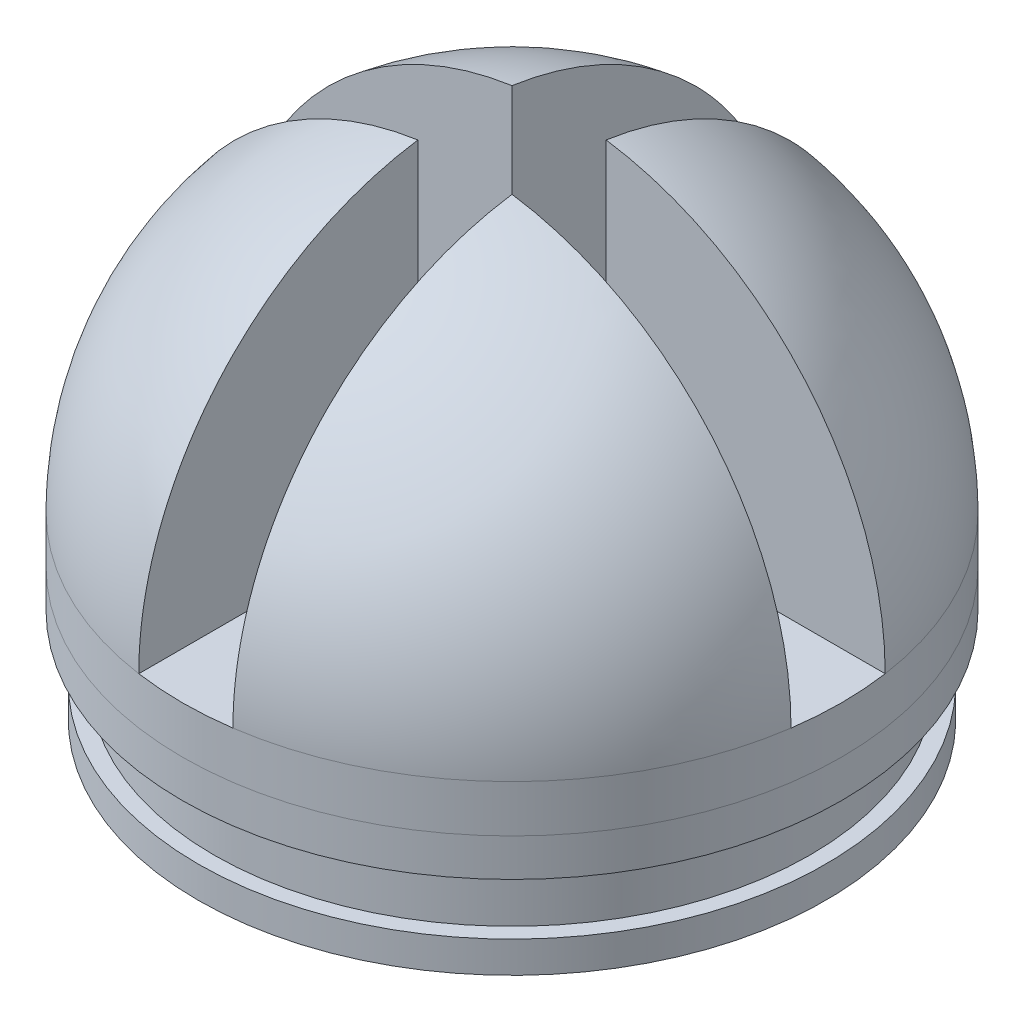
ISO-10303-21;
HEADER;
FILE_DESCRIPTION(('STEP AP214'),'2;1');
FILE_NAME('part.step','',(''),(''),'','','');
FILE_SCHEMA(('AUTOMOTIVE_DESIGN { 1 0 10303 214 1 1 1 1 }'));
ENDSEC;
DATA;
#1=APPLICATION_CONTEXT('core data for automotive mechanical design processes');
#2=APPLICATION_PROTOCOL_DEFINITION('international standard','automotive_design',2000,#1);
#3=PRODUCT_CONTEXT('',#1,'mechanical');
#4=PRODUCT('Part','Part','',(#3));
#5=PRODUCT_RELATED_PRODUCT_CATEGORY('part','',(#4));
#6=PRODUCT_DEFINITION_FORMATION('','',#4);
#7=PRODUCT_DEFINITION_CONTEXT('part definition',#1,'design');
#8=PRODUCT_DEFINITION('design','',#6,#7);
#9=PRODUCT_DEFINITION_SHAPE('','',#8);
#10=(LENGTH_UNIT() NAMED_UNIT(*) SI_UNIT(.MILLI.,.METRE.));
#11=(NAMED_UNIT(*) PLANE_ANGLE_UNIT() SI_UNIT($,.RADIAN.));
#12=(NAMED_UNIT(*) SI_UNIT($,.STERADIAN.) SOLID_ANGLE_UNIT());
#13=UNCERTAINTY_MEASURE_WITH_UNIT(LENGTH_MEASURE(1.E-05),#10,'distance_accuracy_value','');
#14=(GEOMETRIC_REPRESENTATION_CONTEXT(3) GLOBAL_UNCERTAINTY_ASSIGNED_CONTEXT((#13)) GLOBAL_UNIT_ASSIGNED_CONTEXT((#10,
#11,#12)) REPRESENTATION_CONTEXT('',''));
#15=CARTESIAN_POINT('',(0.,0.,0.));
#16=DIRECTION('',(0.,0.,1.));
#17=DIRECTION('',(1.,0.,0.));
#18=AXIS2_PLACEMENT_3D('',#15,#16,#17);
#19=CARTESIAN_POINT('',(0.00115388982795082,2.84938011278044,0.));
#20=DIRECTION('',(0.,1.,0.));
#21=DIRECTION('',(0.,0.,1.));
#22=AXIS2_PLACEMENT_3D('',#19,#20,#21);
#23=PLANE('',#22);
#24=DIRECTION('',(0.,0.,-1.));
#25=VECTOR('',#24,1.);
#26=CARTESIAN_POINT('',(38.101153889828,2.84938011278044,38.1));
#27=LINE('',#26,#25);
#28=CARTESIAN_POINT('',(38.101153889828,2.84938011278044,263.964543073497));
#29=VERTEX_POINT('',#28);
#30=CARTESIAN_POINT('',(38.101153889828,2.84938011278044,-263.964543073497));
#31=VERTEX_POINT('',#30);
#32=EDGE_CURVE('E300',#29,#31,#27,.T.);
#33=ORIENTED_EDGE('',*,*,#32,.T.);
#34=CARTESIAN_POINT('',(0.00115388982795082,2.84938011278042,0.));
#35=DIRECTION('',(0.,1.,0.));
#36=DIRECTION('',(0.,0.,1.));
#37=AXIS2_PLACEMENT_3D('',#34,#35,#36);
#38=CIRCLE('',#37,266.7);
#39=CARTESIAN_POINT('',(-38.098846110172,2.84938011278044,-263.964543073497));
#40=VERTEX_POINT('',#39);
#41=EDGE_CURVE('E276',#31,#40,#38,.T.);
#42=ORIENTED_EDGE('',*,*,#41,.T.);
#43=DIRECTION('',(0.,0.,1.));
#44=VECTOR('',#43,1.);
#45=CARTESIAN_POINT('',(-38.098846110172,2.84938011278044,38.1));
#46=LINE('',#45,#44);
#47=CARTESIAN_POINT('',(-38.098846110172,2.84938011278042,263.964543073497));
#48=VERTEX_POINT('',#47);
#49=EDGE_CURVE('E221',#40,#48,#46,.T.);
#50=ORIENTED_EDGE('',*,*,#49,.T.);
#51=EDGE_CURVE('E232',#48,#29,#38,.T.);
#52=ORIENTED_EDGE('',*,*,#51,.T.);
#53=EDGE_LOOP('',(#33,#42,#50,#52));
#54=FACE_BOUND('',#53,.T.);
#55=ADVANCED_FACE('F38',(#54),#23,.T.);
#56=DIRECTION('',(-1.,0.,0.));
#57=VECTOR('',#56,1.);
#58=CARTESIAN_POINT('',(263.965696963325,2.84938011278044,-38.1));
#59=LINE('',#58,#57);
#60=CARTESIAN_POINT('',(263.965696963325,2.84938011278044,-38.1));
#61=VERTEX_POINT('',#60);
#62=CARTESIAN_POINT('',(76.3350100540597,2.84938011278044,-38.0999999999999));
#63=VERTEX_POINT('',#62);
#64=EDGE_CURVE('E226',#61,#63,#59,.T.);
#65=ORIENTED_EDGE('',*,*,#64,.T.);
#66=DIRECTION('',(0.,0.,-1.));
#67=VECTOR('',#66,1.);
#68=CARTESIAN_POINT('',(76.3350100540596,2.84938011278044,38.1));
#69=LINE('',#68,#67);
#70=CARTESIAN_POINT('',(76.3350100540596,2.84938011278044,38.1));
#71=VERTEX_POINT('',#70);
#72=EDGE_CURVE('E304',#71,#63,#69,.T.);
#73=ORIENTED_EDGE('',*,*,#72,.F.);
#74=DIRECTION('',(1.,0.,0.));
#75=VECTOR('',#74,1.);
#76=CARTESIAN_POINT('',(38.101153889828,2.84938011278044,38.1));
#77=LINE('',#76,#75);
#78=CARTESIAN_POINT('',(263.965696963325,2.84938011278044,38.1));
#79=VERTEX_POINT('',#78);
#80=EDGE_CURVE('E292',#71,#79,#77,.T.);
#81=ORIENTED_EDGE('',*,*,#80,.T.);
#82=EDGE_CURVE('E240',#79,#61,#38,.T.);
#83=ORIENTED_EDGE('',*,*,#82,.T.);
#84=EDGE_LOOP('',(#65,#73,#81,#83));
#85=FACE_BOUND('',#84,.T.);
#86=ADVANCED_FACE('F185',(#85),#23,.T.);
#87=CARTESIAN_POINT('',(38.1011538898279,2.84938011278044,-38.0999999999999));
#88=DIRECTION('',(0.,0.,-1.));
#89=DIRECTION('',(-1.,0.,0.));
#90=AXIS2_PLACEMENT_3D('',#87,#88,#89);
#91=PLANE('',#90);
#92=DIRECTION('',(0.,-1.,0.));
#93=VECTOR('',#92,1.);
#94=CARTESIAN_POINT('',(76.3350100540597,117.14938011278,-38.0999999999999));
#95=LINE('',#94,#93);
#96=CARTESIAN_POINT('',(76.3350100540597,117.14938011278,-38.0999999999999));
#97=VERTEX_POINT('',#96);
#98=EDGE_CURVE('E298',#97,#63,#95,.T.);
#99=ORIENTED_EDGE('',*,*,#98,.T.);
#100=ORIENTED_EDGE('',*,*,#64,.F.);
#101=CARTESIAN_POINT('',(0.0011538898279394,2.84938011278042,-38.0999999999999));
#102=DIRECTION('',(0.,0.,-1.));
#103=DIRECTION('',(-1.,0.,0.));
#104=AXIS2_PLACEMENT_3D('',#101,#102,#103);
#105=CIRCLE('',#104,263.964543073497);
#106=CARTESIAN_POINT('',(38.1011538898279,264.04982038806,-38.0999999999999));
#107=VERTEX_POINT('',#106);
#108=EDGE_CURVE('E246',#61,#107,#105,.F.);
#109=ORIENTED_EDGE('',*,*,#108,.T.);
#110=DIRECTION('',(0.,1.,0.));
#111=VECTOR('',#110,1.);
#112=CARTESIAN_POINT('',(38.1011538898279,2.84938011278044,-38.0999999999999));
#113=LINE('',#112,#111);
#114=CARTESIAN_POINT('',(38.1011538898279,117.14938011278,-38.0999999999999));
#115=VERTEX_POINT('',#114);
#116=EDGE_CURVE('E235',#115,#107,#113,.T.);
#117=ORIENTED_EDGE('',*,*,#116,.F.);
#118=DIRECTION('',(-1.,0.,0.));
#119=VECTOR('',#118,1.);
#120=CARTESIAN_POINT('',(76.3350100540597,117.14938011278,-38.0999999999999));
#121=LINE('',#120,#119);
#122=EDGE_CURVE('E303',#97,#115,#121,.T.);
#123=ORIENTED_EDGE('',*,*,#122,.F.);
#124=EDGE_LOOP('',(#99,#100,#109,#117,#123));
#125=FACE_BOUND('',#124,.T.);
#126=ADVANCED_FACE('F192',(#125),#91,.F.);
#127=CARTESIAN_POINT('',(289.64463626496,2.84938011278044,38.1));
#128=DIRECTION('',(0.,0.,1.));
#129=DIRECTION('',(1.,0.,0.));
#130=AXIS2_PLACEMENT_3D('',#127,#128,#129);
#131=PLANE('',#130);
#132=DIRECTION('',(0.,-1.,0.));
#133=VECTOR('',#132,1.);
#134=CARTESIAN_POINT('',(76.3350100540596,117.14938011278,38.1));
#135=LINE('',#134,#133);
#136=CARTESIAN_POINT('',(76.3350100540596,117.14938011278,38.1));
#137=VERTEX_POINT('',#136);
#138=EDGE_CURVE('E317',#137,#71,#135,.T.);
#139=ORIENTED_EDGE('',*,*,#138,.F.);
#140=DIRECTION('',(1.,0.,0.));
#141=VECTOR('',#140,1.);
#142=CARTESIAN_POINT('',(38.101153889828,117.14938011278,38.1));
#143=LINE('',#142,#141);
#144=CARTESIAN_POINT('',(38.101153889828,117.14938011278,38.1));
#145=VERTEX_POINT('',#144);
#146=EDGE_CURVE('E306',#145,#137,#143,.T.);
#147=ORIENTED_EDGE('',*,*,#146,.F.);
#148=DIRECTION('',(0.,1.,0.));
#149=VECTOR('',#148,1.);
#150=CARTESIAN_POINT('',(38.101153889828,2.84938011278044,38.1));
#151=LINE('',#150,#149);
#152=CARTESIAN_POINT('',(38.101153889828,264.04982038806,38.1));
#153=VERTEX_POINT('',#152);
#154=EDGE_CURVE('E224',#145,#153,#151,.T.);
#155=ORIENTED_EDGE('',*,*,#154,.T.);
#156=CARTESIAN_POINT('',(0.00115388982795082,2.84938011278042,38.1));
#157=DIRECTION('',(0.,0.,1.));
#158=DIRECTION('',(1.,0.,0.));
#159=AXIS2_PLACEMENT_3D('',#156,#157,#158);
#160=CIRCLE('',#159,263.964543073497);
#161=EDGE_CURVE('E136',#153,#79,#160,.F.);
#162=ORIENTED_EDGE('',*,*,#161,.T.);
#163=ORIENTED_EDGE('',*,*,#80,.F.);
#164=EDGE_LOOP('',(#139,#147,#155,#162,#163));
#165=FACE_BOUND('',#164,.T.);
#166=ADVANCED_FACE('F426',(#165),#131,.F.);
#167=CARTESIAN_POINT('',(-274.646901319599,2.84938011278044,38.1));
#168=DIRECTION('',(0.,0.,1.));
#169=DIRECTION('',(1.,0.,0.));
#170=AXIS2_PLACEMENT_3D('',#167,#168,#169);
#171=PLANE('',#170);
#172=DIRECTION('',(0.,-1.,0.));
#173=VECTOR('',#172,1.);
#174=CARTESIAN_POINT('',(-76.5155730072906,117.14938011278,38.1));
#175=LINE('',#174,#173);
#176=CARTESIAN_POINT('',(-76.5155730072906,117.14938011278,38.1));
#177=VERTEX_POINT('',#176);
#178=CARTESIAN_POINT('',(-76.5155730072906,2.84938011278044,38.1));
#179=VERTEX_POINT('',#178);
#180=EDGE_CURVE('E328',#177,#179,#175,.T.);
#181=ORIENTED_EDGE('',*,*,#180,.T.);
#182=DIRECTION('',(1.,0.,0.));
#183=VECTOR('',#182,1.);
#184=CARTESIAN_POINT('',(-274.646901319599,2.84938011278044,38.1));
#185=LINE('',#184,#183);
#186=CARTESIAN_POINT('',(-263.963389183669,2.84938011278044,38.1));
#187=VERTEX_POINT('',#186);
#188=EDGE_CURVE('E212',#187,#179,#185,.T.);
#189=ORIENTED_EDGE('',*,*,#188,.F.);
#190=CARTESIAN_POINT('',(0.00115388982795082,2.84938011278042,38.1));
#191=DIRECTION('',(0.,0.,1.));
#192=DIRECTION('',(1.,0.,0.));
#193=AXIS2_PLACEMENT_3D('',#190,#191,#192);
#194=CIRCLE('',#193,263.964543073497);
#195=CARTESIAN_POINT('',(-38.098846110172,264.04982038806,38.1));
#196=VERTEX_POINT('',#195);
#197=EDGE_CURVE('E258',#187,#196,#194,.F.);
#198=ORIENTED_EDGE('',*,*,#197,.T.);
#199=DIRECTION('',(0.,1.,0.));
#200=VECTOR('',#199,1.);
#201=CARTESIAN_POINT('',(-38.098846110172,2.84938011278044,38.1));
#202=LINE('',#201,#200);
#203=CARTESIAN_POINT('',(-38.0988461101721,117.14938011278,38.1));
#204=VERTEX_POINT('',#203);
#205=EDGE_CURVE('E230',#204,#196,#202,.T.);
#206=ORIENTED_EDGE('',*,*,#205,.F.);
#207=DIRECTION('',(1.,0.,0.));
#208=VECTOR('',#207,1.);
#209=CARTESIAN_POINT('',(-38.0988461101721,117.14938011278,38.1));
#210=LINE('',#209,#208);
#211=EDGE_CURVE('E324',#177,#204,#210,.T.);
#212=ORIENTED_EDGE('',*,*,#211,.F.);
#213=EDGE_LOOP('',(#181,#189,#198,#206,#212));
#214=FACE_BOUND('',#213,.T.);
#215=ADVANCED_FACE('F206',(#214),#171,.F.);
#216=CARTESIAN_POINT('',(-274.646901319599,2.84938011278044,-38.1));
#217=DIRECTION('',(0.,0.,-1.));
#218=DIRECTION('',(-1.,0.,0.));
#219=AXIS2_PLACEMENT_3D('',#216,#217,#218);
#220=PLANE('',#219);
#221=DIRECTION('',(0.,-1.,0.));
#222=VECTOR('',#221,1.);
#223=CARTESIAN_POINT('',(-76.5155730072906,117.14938011278,-38.1));
#224=LINE('',#223,#222);
#225=CARTESIAN_POINT('',(-76.5155730072906,117.14938011278,-38.1));
#226=VERTEX_POINT('',#225);
#227=CARTESIAN_POINT('',(-76.5155730072906,2.84938011278044,-38.1));
#228=VERTEX_POINT('',#227);
#229=EDGE_CURVE('E331',#226,#228,#224,.T.);
#230=ORIENTED_EDGE('',*,*,#229,.F.);
#231=DIRECTION('',(-1.,0.,0.));
#232=VECTOR('',#231,1.);
#233=CARTESIAN_POINT('',(-76.5155730072906,117.14938011278,-38.1));
#234=LINE('',#233,#232);
#235=CARTESIAN_POINT('',(-38.098846110172,117.14938011278,-38.1));
#236=VERTEX_POINT('',#235);
#237=EDGE_CURVE('E319',#236,#226,#234,.T.);
#238=ORIENTED_EDGE('',*,*,#237,.F.);
#239=DIRECTION('',(0.,1.,0.));
#240=VECTOR('',#239,1.);
#241=CARTESIAN_POINT('',(-38.098846110172,2.84938011278044,-38.1));
#242=LINE('',#241,#240);
#243=CARTESIAN_POINT('',(-38.098846110172,264.04982038806,-38.1));
#244=VERTEX_POINT('',#243);
#245=EDGE_CURVE('E233',#236,#244,#242,.T.);
#246=ORIENTED_EDGE('',*,*,#245,.T.);
#247=CARTESIAN_POINT('',(0.00115388982795082,2.84938011278042,-38.1));
#248=DIRECTION('',(0.,0.,-1.));
#249=DIRECTION('',(-1.,0.,0.));
#250=AXIS2_PLACEMENT_3D('',#247,#248,#249);
#251=CIRCLE('',#250,263.964543073497);
#252=CARTESIAN_POINT('',(-263.963389183669,2.84938011278044,-38.1));
#253=VERTEX_POINT('',#252);
#254=EDGE_CURVE('E255',#244,#253,#251,.F.);
#255=ORIENTED_EDGE('',*,*,#254,.T.);
#256=DIRECTION('',(-1.,0.,0.));
#257=VECTOR('',#256,1.);
#258=CARTESIAN_POINT('',(-274.646901319599,2.84938011278044,-38.1));
#259=LINE('',#258,#257);
#260=EDGE_CURVE('E222',#228,#253,#259,.T.);
#261=ORIENTED_EDGE('',*,*,#260,.F.);
#262=EDGE_LOOP('',(#230,#238,#246,#255,#261));
#263=FACE_BOUND('',#262,.T.);
#264=ADVANCED_FACE('F198',(#263),#220,.F.);
#265=ORIENTED_EDGE('',*,*,#188,.T.);
#266=DIRECTION('',(0.,0.,1.));
#267=VECTOR('',#266,1.);
#268=CARTESIAN_POINT('',(-76.5155730072906,2.84938011278044,38.1));
#269=LINE('',#268,#267);
#270=EDGE_CURVE('E213',#228,#179,#269,.T.);
#271=ORIENTED_EDGE('',*,*,#270,.F.);
#272=ORIENTED_EDGE('',*,*,#260,.T.);
#273=EDGE_CURVE('E216',#253,#187,#38,.T.);
#274=ORIENTED_EDGE('',*,*,#273,.T.);
#275=EDGE_LOOP('',(#265,#271,#272,#274));
#276=FACE_BOUND('',#275,.T.);
#277=ADVANCED_FACE('F188',(#276),#23,.T.);
#278=CARTESIAN_POINT('',(0.00115388982795082,2.84938011278042,0.));
#279=DIRECTION('',(0.,0.,1.));
#280=DIRECTION('',(1.,0.,0.));
#281=AXIS2_PLACEMENT_3D('',#278,#279,#280);
#282=SPHERICAL_SURFACE('',#281,266.7);
#283=CARTESIAN_POINT('',(-38.098846110172,2.84938011278042,0.));
#284=DIRECTION('',(-1.,0.,0.));
#285=DIRECTION('',(0.,0.,1.));
#286=AXIS2_PLACEMENT_3D('',#283,#284,#285);
#287=CIRCLE('',#286,263.964543073497);
#288=EDGE_CURVE('E46',#196,#48,#287,.F.);
#289=ORIENTED_EDGE('',*,*,#288,.F.);
#290=ORIENTED_EDGE('',*,*,#197,.F.);
#291=EDGE_CURVE('E271',#187,#48,#38,.T.);
#292=ORIENTED_EDGE('',*,*,#291,.T.);
#293=EDGE_LOOP('',(#289,#290,#292));
#294=FACE_BOUND('',#293,.T.);
#295=ADVANCED_FACE('F197',(#294),#282,.T.);
#296=ORIENTED_EDGE('',*,*,#254,.F.);
#297=CARTESIAN_POINT('',(-38.098846110172,2.84938011278042,0.));
#298=DIRECTION('',(-1.,0.,0.));
#299=DIRECTION('',(0.,0.,1.));
#300=AXIS2_PLACEMENT_3D('',#297,#298,#299);
#301=CIRCLE('',#300,263.964543073497);
#302=EDGE_CURVE('E252',#40,#244,#301,.F.);
#303=ORIENTED_EDGE('',*,*,#302,.F.);
#304=EDGE_CURVE('E274',#40,#253,#38,.T.);
#305=ORIENTED_EDGE('',*,*,#304,.T.);
#306=EDGE_LOOP('',(#296,#303,#305));
#307=FACE_BOUND('',#306,.T.);
#308=ADVANCED_FACE('F204',(#307),#282,.T.);
#309=CARTESIAN_POINT('',(38.1011538898279,2.84938011278042,0.));
#310=DIRECTION('',(1.,0.,0.));
#311=DIRECTION('',(0.,0.,-1.));
#312=AXIS2_PLACEMENT_3D('',#309,#310,#311);
#313=CIRCLE('',#312,263.964543073497);
#314=EDGE_CURVE('E249',#107,#31,#313,.F.);
#315=ORIENTED_EDGE('',*,*,#314,.F.);
#316=ORIENTED_EDGE('',*,*,#108,.F.);
#317=EDGE_CURVE('E281',#61,#31,#38,.T.);
#318=ORIENTED_EDGE('',*,*,#317,.T.);
#319=EDGE_LOOP('',(#315,#316,#318));
#320=FACE_BOUND('',#319,.T.);
#321=ADVANCED_FACE('F158',(#320),#282,.T.);
#322=CARTESIAN_POINT('',(0.00115388982795082,2.84938011278042,0.));
#323=DIRECTION('',(0.,-1.,0.));
#324=DIRECTION('',(0.,0.,-1.));
#325=AXIS2_PLACEMENT_3D('',#322,#323,#324);
#326=CYLINDRICAL_SURFACE('',#325,266.7);
#327=EDGE_CURVE('E137',#29,#79,#38,.T.);
#328=ORIENTED_EDGE('',*,*,#327,.F.);
#329=ORIENTED_EDGE('',*,*,#51,.F.);
#330=ORIENTED_EDGE('',*,*,#291,.F.);
#331=ORIENTED_EDGE('',*,*,#273,.F.);
#332=ORIENTED_EDGE('',*,*,#304,.F.);
#333=ORIENTED_EDGE('',*,*,#41,.F.);
#334=ORIENTED_EDGE('',*,*,#317,.F.);
#335=ORIENTED_EDGE('',*,*,#82,.F.);
#336=EDGE_LOOP('',(#328,#329,#330,#331,#332,#333,#334,#335));
#337=FACE_BOUND('',#336,.T.);
#338=CARTESIAN_POINT('',(0.00115388982795082,-35.2506198872196,0.));
#339=DIRECTION('',(0.,1.,0.));
#340=DIRECTION('',(-2.16327452864273E-06,0.,-0.99999999999766));
#341=AXIS2_PLACEMENT_3D('',#338,#339,#340);
#342=CIRCLE('',#341,266.7);
#343=CARTESIAN_POINT('',(0.000576944511056181,-35.2506198872196,-266.699999999376));
#344=VERTEX_POINT('',#343);
#345=CARTESIAN_POINT('',(0.000576945316894636,-35.2506198872196,266.699999999376));
#346=VERTEX_POINT('',#345);
#347=EDGE_CURVE('E52',#344,#346,#342,.T.);
#348=ORIENTED_EDGE('',*,*,#347,.T.);
#349=CARTESIAN_POINT('',(0.00115388982795082,-35.2506198872196,0.));
#350=DIRECTION('',(0.,1.,0.));
#351=DIRECTION('',(-2.16327150644742E-06,0.,0.99999999999766));
#352=AXIS2_PLACEMENT_3D('',#349,#350,#351);
#353=CIRCLE('',#352,266.7);
#354=EDGE_CURVE('E131',#346,#344,#353,.T.);
#355=ORIENTED_EDGE('',*,*,#354,.T.);
#356=EDGE_LOOP('',(#348,#355));
#357=FACE_BOUND('',#356,.T.);
#358=ADVANCED_FACE('F141',(#337,#357),#326,.T.);
#359=CARTESIAN_POINT('',(38.101153889828,2.84938011278042,0.));
#360=DIRECTION('',(1.,0.,0.));
#361=DIRECTION('',(0.,0.,-1.));
#362=AXIS2_PLACEMENT_3D('',#359,#360,#361);
#363=CIRCLE('',#362,263.964543073497);
#364=EDGE_CURVE('E243',#29,#153,#363,.F.);
#365=ORIENTED_EDGE('',*,*,#364,.F.);
#366=ORIENTED_EDGE('',*,*,#327,.T.);
#367=ORIENTED_EDGE('',*,*,#161,.F.);
#368=EDGE_LOOP('',(#365,#366,#367));
#369=FACE_BOUND('',#368,.T.);
#370=ADVANCED_FACE('F40',(#369),#282,.T.);
#371=CARTESIAN_POINT('',(38.101153889828,2.84938011278044,38.1));
#372=DIRECTION('',(1.,0.,0.));
#373=DIRECTION('',(0.,0.,-1.));
#374=AXIS2_PLACEMENT_3D('',#371,#372,#373);
#375=PLANE('',#374);
#376=CARTESIAN_POINT('',(38.101153889828,79.0493801127804,0.));
#377=DIRECTION('',(1.,0.,0.));
#378=DIRECTION('',(0.,0.,-1.));
#379=AXIS2_PLACEMENT_3D('',#376,#377,#378);
#380=CIRCLE('',#379,30.422584401474);
#381=CARTESIAN_POINT('',(38.101153889828,79.0493801127804,-30.422584401474));
#382=VERTEX_POINT('',#381);
#383=EDGE_CURVE('E308',#382,#382,#380,.T.);
#384=ORIENTED_EDGE('',*,*,#383,.T.);
#385=EDGE_LOOP('',(#384));
#386=FACE_BOUND('',#385,.T.);
#387=ORIENTED_EDGE('',*,*,#364,.T.);
#388=ORIENTED_EDGE('',*,*,#154,.F.);
#389=DIRECTION('',(0.,0.,1.));
#390=VECTOR('',#389,1.);
#391=CARTESIAN_POINT('',(38.1011538898279,117.14938011278,-38.0999999999999));
#392=LINE('',#391,#390);
#393=EDGE_CURVE('E61',#115,#145,#392,.T.);
#394=ORIENTED_EDGE('',*,*,#393,.F.);
#395=ORIENTED_EDGE('',*,*,#116,.T.);
#396=ORIENTED_EDGE('',*,*,#314,.T.);
#397=ORIENTED_EDGE('',*,*,#32,.F.);
#398=EDGE_LOOP('',(#387,#388,#394,#395,#396,#397));
#399=FACE_BOUND('',#398,.T.);
#400=ADVANCED_FACE('F160',(#386,#399),#375,.F.);
#401=CARTESIAN_POINT('',(-38.098846110172,2.84938011278044,38.1));
#402=DIRECTION('',(-1.,0.,0.));
#403=DIRECTION('',(0.,0.,1.));
#404=AXIS2_PLACEMENT_3D('',#401,#402,#403);
#405=PLANE('',#404);
#406=CARTESIAN_POINT('',(-38.098846110172,79.0493801127804,0.));
#407=DIRECTION('',(-1.,0.,0.));
#408=DIRECTION('',(0.,0.,1.));
#409=AXIS2_PLACEMENT_3D('',#406,#407,#408);
#410=CIRCLE('',#409,30.422584401474);
#411=CARTESIAN_POINT('',(-38.098846110172,79.0493801127804,30.422584401474));
#412=VERTEX_POINT('',#411);
#413=EDGE_CURVE('E379',#412,#412,#410,.T.);
#414=ORIENTED_EDGE('',*,*,#413,.T.);
#415=EDGE_LOOP('',(#414));
#416=FACE_BOUND('',#415,.T.);
#417=ORIENTED_EDGE('',*,*,#288,.T.);
#418=ORIENTED_EDGE('',*,*,#49,.F.);
#419=ORIENTED_EDGE('',*,*,#302,.T.);
#420=ORIENTED_EDGE('',*,*,#245,.F.);
#421=DIRECTION('',(0.,0.,-1.));
#422=VECTOR('',#421,1.);
#423=CARTESIAN_POINT('',(-38.098846110172,117.14938011278,-38.1));
#424=LINE('',#423,#422);
#425=EDGE_CURVE('E326',#204,#236,#424,.T.);
#426=ORIENTED_EDGE('',*,*,#425,.F.);
#427=ORIENTED_EDGE('',*,*,#205,.T.);
#428=EDGE_LOOP('',(#417,#418,#419,#420,#426,#427));
#429=FACE_BOUND('',#428,.T.);
#430=ADVANCED_FACE('F264',(#416,#429),#405,.F.);
#431=CARTESIAN_POINT('',(-76.5155730072906,117.14938011278,38.1));
#432=DIRECTION('',(1.,0.,0.));
#433=DIRECTION('',(0.,0.,-1.));
#434=AXIS2_PLACEMENT_3D('',#431,#432,#433);
#435=PLANE('',#434);
#436=CARTESIAN_POINT('',(-76.5155730072906,79.0493801127804,0.));
#437=DIRECTION('',(1.,0.,0.));
#438=DIRECTION('',(0.,0.,-1.));
#439=AXIS2_PLACEMENT_3D('',#436,#437,#438);
#440=CIRCLE('',#439,30.422584401474);
#441=CARTESIAN_POINT('',(-76.5155730072906,79.0493801127804,-30.422584401474));
#442=VERTEX_POINT('',#441);
#443=EDGE_CURVE('E377',#442,#442,#440,.T.);
#444=ORIENTED_EDGE('',*,*,#443,.T.);
#445=EDGE_LOOP('',(#444));
#446=FACE_BOUND('',#445,.T.);
#447=ORIENTED_EDGE('',*,*,#270,.T.);
#448=ORIENTED_EDGE('',*,*,#180,.F.);
#449=DIRECTION('',(0.,0.,1.));
#450=VECTOR('',#449,1.);
#451=CARTESIAN_POINT('',(-76.5155730072906,117.14938011278,38.1));
#452=LINE('',#451,#450);
#453=EDGE_CURVE('E322',#226,#177,#452,.T.);
#454=ORIENTED_EDGE('',*,*,#453,.F.);
#455=ORIENTED_EDGE('',*,*,#229,.T.);
#456=EDGE_LOOP('',(#447,#448,#454,#455));
#457=FACE_BOUND('',#456,.T.);
#458=ADVANCED_FACE('F336',(#446,#457),#435,.F.);
#459=CARTESIAN_POINT('',(0.00115388982795082,117.14938011278,0.));
#460=DIRECTION('',(0.,-1.,0.));
#461=DIRECTION('',(0.,0.,-1.));
#462=AXIS2_PLACEMENT_3D('',#459,#460,#461);
#463=PLANE('',#462);
#464=ORIENTED_EDGE('',*,*,#237,.T.);
#465=ORIENTED_EDGE('',*,*,#453,.T.);
#466=ORIENTED_EDGE('',*,*,#211,.T.);
#467=ORIENTED_EDGE('',*,*,#425,.T.);
#468=EDGE_LOOP('',(#464,#465,#466,#467));
#469=FACE_BOUND('',#468,.T.);
#470=ADVANCED_FACE('F342',(#469),#463,.F.);
#471=CARTESIAN_POINT('',(76.3350100540596,117.14938011278,38.1));
#472=DIRECTION('',(-1.,0.,0.));
#473=DIRECTION('',(0.,0.,1.));
#474=AXIS2_PLACEMENT_3D('',#471,#472,#473);
#475=PLANE('',#474);
#476=CARTESIAN_POINT('',(76.3350100540597,79.0493801127804,0.));
#477=DIRECTION('',(1.,0.,0.));
#478=DIRECTION('',(0.,0.,-1.));
#479=AXIS2_PLACEMENT_3D('',#476,#477,#478);
#480=CIRCLE('',#479,30.422584401474);
#481=CARTESIAN_POINT('',(76.3350100540597,79.0493801127804,-30.422584401474));
#482=VERTEX_POINT('',#481);
#483=EDGE_CURVE('E369',#482,#482,#480,.T.);
#484=ORIENTED_EDGE('',*,*,#483,.F.);
#485=EDGE_LOOP('',(#484));
#486=FACE_BOUND('',#485,.T.);
#487=ORIENTED_EDGE('',*,*,#72,.T.);
#488=ORIENTED_EDGE('',*,*,#98,.F.);
#489=DIRECTION('',(0.,0.,-1.));
#490=VECTOR('',#489,1.);
#491=CARTESIAN_POINT('',(76.3350100540596,117.14938011278,38.1));
#492=LINE('',#491,#490);
#493=EDGE_CURVE('E314',#137,#97,#492,.T.);
#494=ORIENTED_EDGE('',*,*,#493,.F.);
#495=ORIENTED_EDGE('',*,*,#138,.T.);
#496=EDGE_LOOP('',(#487,#488,#494,#495));
#497=FACE_BOUND('',#496,.T.);
#498=ADVANCED_FACE('F344',(#486,#497),#475,.F.);
#499=CARTESIAN_POINT('',(0.00115388982795082,117.14938011278,0.));
#500=DIRECTION('',(0.,1.,0.));
#501=DIRECTION('',(0.,0.,1.));
#502=AXIS2_PLACEMENT_3D('',#499,#500,#501);
#503=PLANE('',#502);
#504=ORIENTED_EDGE('',*,*,#122,.T.);
#505=ORIENTED_EDGE('',*,*,#393,.T.);
#506=ORIENTED_EDGE('',*,*,#146,.T.);
#507=ORIENTED_EDGE('',*,*,#493,.T.);
#508=EDGE_LOOP('',(#504,#505,#506,#507));
#509=FACE_BOUND('',#508,.T.);
#510=ADVANCED_FACE('F350',(#509),#503,.T.);
#511=CARTESIAN_POINT('',(-129.40498994594,79.0493801127804,0.));
#512=DIRECTION('',(1.,0.,0.));
#513=DIRECTION('',(0.,0.,-1.));
#514=AXIS2_PLACEMENT_3D('',#511,#512,#513);
#515=CYLINDRICAL_SURFACE('',#514,30.422584401474);
#516=ORIENTED_EDGE('',*,*,#483,.T.);
#517=EDGE_LOOP('',(#516));
#518=FACE_BOUND('',#517,.T.);
#519=ORIENTED_EDGE('',*,*,#383,.F.);
#520=EDGE_LOOP('',(#519));
#521=FACE_BOUND('',#520,.T.);
#522=ADVANCED_FACE('F357',(#518,#521),#515,.F.);
#523=ORIENTED_EDGE('',*,*,#443,.F.);
#524=EDGE_LOOP('',(#523));
#525=FACE_BOUND('',#524,.T.);
#526=ORIENTED_EDGE('',*,*,#413,.F.);
#527=EDGE_LOOP('',(#526));
#528=FACE_BOUND('',#527,.T.);
#529=ADVANCED_FACE('F175',(#525,#528),#515,.F.);
#530=CARTESIAN_POINT('',(0.,-65.7306198872196,0.));
#531=DIRECTION('',(0.,1.,0.));
#532=DIRECTION('',(0.,0.,1.));
#533=AXIS2_PLACEMENT_3D('',#530,#531,#532);
#534=CYLINDRICAL_SURFACE('',#533,266.7);
#535=CARTESIAN_POINT('',(0.,-65.7306198872196,0.));
#536=DIRECTION('',(0.,1.,0.));
#537=DIRECTION('',(0.,0.,1.));
#538=AXIS2_PLACEMENT_3D('',#535,#536,#537);
#539=CIRCLE('',#538,266.7);
#540=CARTESIAN_POINT('',(0.,-65.7306198872196,266.7));
#541=VERTEX_POINT('',#540);
#542=EDGE_CURVE('E142',#541,#541,#539,.T.);
#543=ORIENTED_EDGE('',*,*,#542,.T.);
#544=EDGE_LOOP('',(#543));
#545=FACE_BOUND('',#544,.T.);
#546=ORIENTED_EDGE('',*,*,#354,.F.);
#547=ORIENTED_EDGE('',*,*,#347,.F.);
#548=EDGE_LOOP('',(#546,#547));
#549=FACE_BOUND('',#548,.T.);
#550=ADVANCED_FACE('F133',(#545,#549),#534,.T.);
#551=CARTESIAN_POINT('',(0.00115388982795082,-65.7306198872196,0.));
#552=DIRECTION('',(0.,-1.,0.));
#553=DIRECTION('',(0.,0.,-1.));
#554=AXIS2_PLACEMENT_3D('',#551,#552,#553);
#555=PLANE('',#554);
#556=CARTESIAN_POINT('',(0.,-65.7306198872196,0.));
#557=DIRECTION('',(0.,-1.,0.));
#558=DIRECTION('',(0.,0.,-1.));
#559=AXIS2_PLACEMENT_3D('',#556,#557,#558);
#560=CIRCLE('',#559,241.3);
#561=CARTESIAN_POINT('',(0.,-65.7306198872196,-241.3));
#562=VERTEX_POINT('',#561);
#563=EDGE_CURVE('E602',#562,#562,#560,.T.);
#564=ORIENTED_EDGE('',*,*,#563,.F.);
#565=EDGE_LOOP('',(#564));
#566=FACE_BOUND('',#565,.T.);
#567=ORIENTED_EDGE('',*,*,#542,.F.);
#568=EDGE_LOOP('',(#567));
#569=FACE_BOUND('',#568,.T.);
#570=ADVANCED_FACE('F162',(#566,#569),#555,.T.);
#571=CARTESIAN_POINT('',(0.,-116.53061988722,0.));
#572=DIRECTION('',(0.,1.,0.));
#573=DIRECTION('',(0.,0.,1.));
#574=AXIS2_PLACEMENT_3D('',#571,#572,#573);
#575=CYLINDRICAL_SURFACE('',#574,241.3);
#576=CARTESIAN_POINT('',(0.,-116.53061988722,0.));
#577=DIRECTION('',(0.,-1.,0.));
#578=DIRECTION('',(0.,0.,-1.));
#579=AXIS2_PLACEMENT_3D('',#576,#577,#578);
#580=CIRCLE('',#579,241.3);
#581=CARTESIAN_POINT('',(0.,-116.53061988722,-241.3));
#582=VERTEX_POINT('',#581);
#583=EDGE_CURVE('E143',#582,#582,#580,.T.);
#584=ORIENTED_EDGE('',*,*,#583,.F.);
#585=EDGE_LOOP('',(#584));
#586=FACE_BOUND('',#585,.T.);
#587=ORIENTED_EDGE('',*,*,#563,.T.);
#588=EDGE_LOOP('',(#587));
#589=FACE_BOUND('',#588,.T.);
#590=ADVANCED_FACE('F165',(#586,#589),#575,.T.);
#591=CARTESIAN_POINT('',(0.,-116.53061988722,0.));
#592=DIRECTION('',(0.,-1.,0.));
#593=DIRECTION('',(0.,0.,-1.));
#594=AXIS2_PLACEMENT_3D('',#591,#592,#593);
#595=PLANE('',#594);
#596=CARTESIAN_POINT('',(0.,-116.53061988722,0.));
#597=DIRECTION('',(0.,-1.,0.));
#598=DIRECTION('',(0.,0.,-1.));
#599=AXIS2_PLACEMENT_3D('',#596,#597,#598);
#600=CIRCLE('',#599,203.2);
#601=CARTESIAN_POINT('',(0.,-116.53061988722,-203.2));
#602=VERTEX_POINT('',#601);
#603=EDGE_CURVE('E589',#602,#602,#600,.T.);
#604=ORIENTED_EDGE('',*,*,#603,.T.);
#605=EDGE_LOOP('',(#604));
#606=FACE_BOUND('',#605,.T.);
#607=CARTESIAN_POINT('',(0.,-116.53061988722,0.));
#608=DIRECTION('',(0.,-1.,0.));
#609=DIRECTION('',(0.,0.,-1.));
#610=AXIS2_PLACEMENT_3D('',#607,#608,#609);
#611=CIRCLE('',#610,215.9);
#612=CARTESIAN_POINT('',(0.,-116.53061988722,-215.9));
#613=VERTEX_POINT('',#612);
#614=EDGE_CURVE('E597',#613,#613,#611,.T.);
#615=ORIENTED_EDGE('',*,*,#614,.F.);
#616=EDGE_LOOP('',(#615));
#617=FACE_BOUND('',#616,.T.);
#618=ADVANCED_FACE('F172',(#606,#617),#595,.F.);
#619=CARTESIAN_POINT('',(0.,-141.93061988722,0.));
#620=DIRECTION('',(0.,-1.,0.));
#621=DIRECTION('',(0.,0.,-1.));
#622=AXIS2_PLACEMENT_3D('',#619,#620,#621);
#623=PLANE('',#622);
#624=CARTESIAN_POINT('',(0.,-141.93061988722,0.));
#625=DIRECTION('',(0.,-1.,0.));
#626=DIRECTION('',(0.,0.,-1.));
#627=AXIS2_PLACEMENT_3D('',#624,#625,#626);
#628=CIRCLE('',#627,254.);
#629=CARTESIAN_POINT('',(0.,-141.93061988722,-254.));
#630=VERTEX_POINT('',#629);
#631=EDGE_CURVE('E594',#630,#630,#628,.T.);
#632=ORIENTED_EDGE('',*,*,#631,.T.);
#633=EDGE_LOOP('',(#632));
#634=FACE_BOUND('',#633,.T.);
#635=CARTESIAN_POINT('',(0.,-141.93061988722,0.));
#636=DIRECTION('',(0.,-1.,0.));
#637=DIRECTION('',(0.,0.,-1.));
#638=AXIS2_PLACEMENT_3D('',#635,#636,#637);
#639=CIRCLE('',#638,203.2);
#640=CARTESIAN_POINT('',(0.,-141.93061988722,-203.2));
#641=VERTEX_POINT('',#640);
#642=EDGE_CURVE('E586',#641,#641,#639,.T.);
#643=ORIENTED_EDGE('',*,*,#642,.F.);
#644=EDGE_LOOP('',(#643));
#645=FACE_BOUND('',#644,.T.);
#646=ADVANCED_FACE('F539',(#634,#645),#623,.T.);
#647=ORIENTED_EDGE('',*,*,#583,.T.);
#648=EDGE_LOOP('',(#647));
#649=FACE_BOUND('',#648,.T.);
#650=CARTESIAN_POINT('',(0.,-116.53061988722,0.));
#651=DIRECTION('',(0.,-1.,0.));
#652=DIRECTION('',(0.,0.,-1.));
#653=AXIS2_PLACEMENT_3D('',#650,#651,#652);
#654=CIRCLE('',#653,254.);
#655=CARTESIAN_POINT('',(0.,-116.53061988722,-254.));
#656=VERTEX_POINT('',#655);
#657=EDGE_CURVE('E591',#656,#656,#654,.T.);
#658=ORIENTED_EDGE('',*,*,#657,.F.);
#659=EDGE_LOOP('',(#658));
#660=FACE_BOUND('',#659,.T.);
#661=ADVANCED_FACE('F542',(#649,#660),#595,.F.);
#662=CARTESIAN_POINT('',(0.,-141.93061988722,0.));
#663=DIRECTION('',(0.,1.,0.));
#664=DIRECTION('',(0.,0.,1.));
#665=AXIS2_PLACEMENT_3D('',#662,#663,#664);
#666=CYLINDRICAL_SURFACE('',#665,254.);
#667=ORIENTED_EDGE('',*,*,#631,.F.);
#668=EDGE_LOOP('',(#667));
#669=FACE_BOUND('',#668,.T.);
#670=ORIENTED_EDGE('',*,*,#657,.T.);
#671=EDGE_LOOP('',(#670));
#672=FACE_BOUND('',#671,.T.);
#673=ADVANCED_FACE('F557',(#669,#672),#666,.T.);
#674=CARTESIAN_POINT('',(0.,-141.93061988722,0.));
#675=DIRECTION('',(0.,1.,0.));
#676=DIRECTION('',(0.,0.,1.));
#677=AXIS2_PLACEMENT_3D('',#674,#675,#676);
#678=CYLINDRICAL_SURFACE('',#677,203.2);
#679=ORIENTED_EDGE('',*,*,#642,.T.);
#680=EDGE_LOOP('',(#679));
#681=FACE_BOUND('',#680,.T.);
#682=ORIENTED_EDGE('',*,*,#603,.F.);
#683=EDGE_LOOP('',(#682));
#684=FACE_BOUND('',#683,.T.);
#685=ADVANCED_FACE('F182',(#681,#684),#678,.F.);
#686=CARTESIAN_POINT('',(0.,-65.7306198872196,0.));
#687=DIRECTION('',(0.,-1.,0.));
#688=DIRECTION('',(0.,0.,-1.));
#689=AXIS2_PLACEMENT_3D('',#686,#687,#688);
#690=CIRCLE('',#689,215.9);
#691=CARTESIAN_POINT('',(0.,-65.7306198872196,-215.9));
#692=VERTEX_POINT('',#691);
#693=EDGE_CURVE('E11',#692,#692,#690,.F.);
#694=ORIENTED_EDGE('',*,*,#693,.F.);
#695=EDGE_LOOP('',(#694));
#696=FACE_BOUND('',#695,.T.);
#697=ADVANCED_FACE('F167',(#696),#555,.T.);
#698=CARTESIAN_POINT('',(0.,-116.53061988722,0.));
#699=DIRECTION('',(0.,1.,0.));
#700=DIRECTION('',(0.,0.,1.));
#701=AXIS2_PLACEMENT_3D('',#698,#699,#700);
#702=CYLINDRICAL_SURFACE('',#701,215.9);
#703=ORIENTED_EDGE('',*,*,#614,.T.);
#704=EDGE_LOOP('',(#703));
#705=FACE_BOUND('',#704,.T.);
#706=ORIENTED_EDGE('',*,*,#693,.T.);
#707=EDGE_LOOP('',(#706));
#708=FACE_BOUND('',#707,.T.);
#709=ADVANCED_FACE('F181',(#705,#708),#702,.F.);
#710=CLOSED_SHELL('',(#55,#86,#126,#166,#215,#264,#277,#295,#308,#321,#358,#370,#400,#430,#458,
#470,#498,#510,#522,#529,#550,#570,#590,#618,#646,#661,#673,#685,#697,#709));
#711=MANIFOLD_SOLID_BREP('B2',#710);
#712=ADVANCED_BREP_SHAPE_REPRESENTATION('',(#18,#711),#14);
#713=SHAPE_DEFINITION_REPRESENTATION(#9,#712);
ENDSEC;
END-ISO-10303-21;
